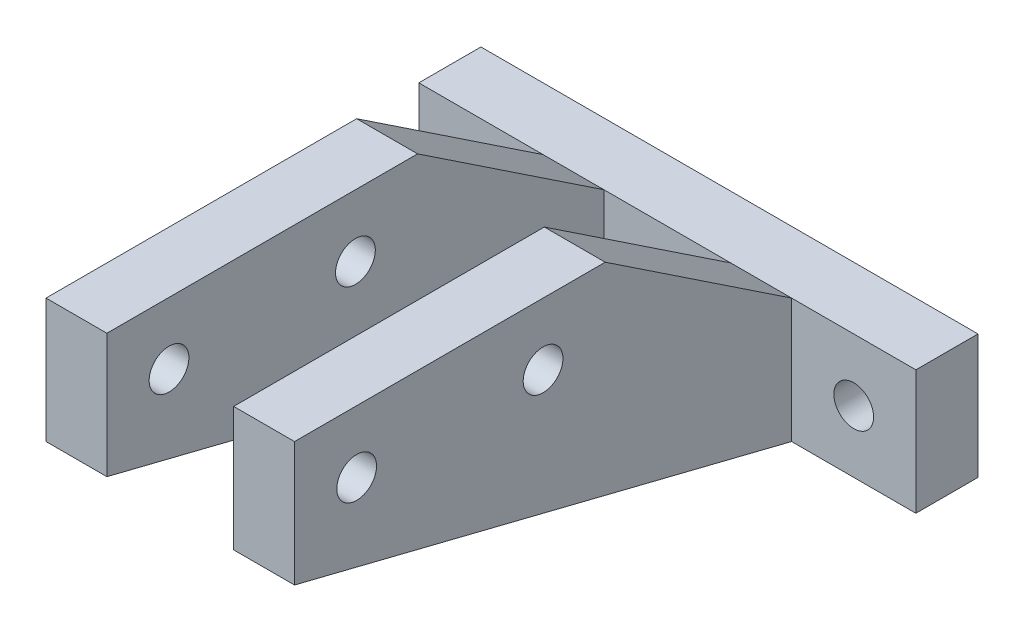
ISO-10303-21;
HEADER;
FILE_DESCRIPTION(('STEP AP214'),'2;1');
FILE_NAME('part.step','',(''),(''),'','','');
FILE_SCHEMA(('AUTOMOTIVE_DESIGN { 1 0 10303 214 1 1 1 1 }'));
ENDSEC;
DATA;
#1=APPLICATION_CONTEXT('core data for automotive mechanical design processes');
#2=APPLICATION_PROTOCOL_DEFINITION('international standard','automotive_design',2000,#1);
#3=PRODUCT_CONTEXT('',#1,'mechanical');
#4=PRODUCT('Part','Part','',(#3));
#5=PRODUCT_RELATED_PRODUCT_CATEGORY('part','',(#4));
#6=PRODUCT_DEFINITION_FORMATION('','',#4);
#7=PRODUCT_DEFINITION_CONTEXT('part definition',#1,'design');
#8=PRODUCT_DEFINITION('design','',#6,#7);
#9=PRODUCT_DEFINITION_SHAPE('','',#8);
#10=(LENGTH_UNIT() NAMED_UNIT(*) SI_UNIT(.MILLI.,.METRE.));
#11=(NAMED_UNIT(*) PLANE_ANGLE_UNIT() SI_UNIT($,.RADIAN.));
#12=(NAMED_UNIT(*) SI_UNIT($,.STERADIAN.) SOLID_ANGLE_UNIT());
#13=UNCERTAINTY_MEASURE_WITH_UNIT(LENGTH_MEASURE(1.E-05),#10,'distance_accuracy_value','');
#14=(GEOMETRIC_REPRESENTATION_CONTEXT(3) GLOBAL_UNCERTAINTY_ASSIGNED_CONTEXT((#13)) GLOBAL_UNIT_ASSIGNED_CONTEXT((#10,
#11,#12)) REPRESENTATION_CONTEXT('',''));
#15=CARTESIAN_POINT('',(0.,0.,0.));
#16=DIRECTION('',(0.,0.,1.));
#17=DIRECTION('',(1.,0.,0.));
#18=AXIS2_PLACEMENT_3D('',#15,#16,#17);
#19=CARTESIAN_POINT('',(0.,0.,5.));
#20=DIRECTION('',(0.,0.,1.));
#21=DIRECTION('',(1.,0.,0.));
#22=AXIS2_PLACEMENT_3D('',#19,#20,#21);
#23=PLANE('',#22);
#24=DIRECTION('',(0.,1.,0.));
#25=VECTOR('',#24,1.);
#26=CARTESIAN_POINT('',(-5.1,-5.,5.));
#27=LINE('',#26,#25);
#28=CARTESIAN_POINT('',(-5.1,0.,5.));
#29=VERTEX_POINT('',#28);
#30=CARTESIAN_POINT('',(-5.1,5.,5.));
#31=VERTEX_POINT('',#30);
#32=EDGE_CURVE('E242',#29,#31,#27,.T.);
#33=ORIENTED_EDGE('',*,*,#32,.F.);
#34=DIRECTION('',(-1.,0.,0.));
#35=VECTOR('',#34,1.);
#36=CARTESIAN_POINT('',(-5.1,0.,5.));
#37=LINE('',#36,#35);
#38=CARTESIAN_POINT('',(5.10000000000001,0.,5.));
#39=VERTEX_POINT('',#38);
#40=EDGE_CURVE('E167',#39,#29,#37,.T.);
#41=ORIENTED_EDGE('',*,*,#40,.F.);
#42=DIRECTION('',(0.,1.,0.));
#43=VECTOR('',#42,1.);
#44=CARTESIAN_POINT('',(5.10000000000001,0.,5.));
#45=LINE('',#44,#43);
#46=CARTESIAN_POINT('',(5.10000000000001,5.,5.));
#47=VERTEX_POINT('',#46);
#48=EDGE_CURVE('E254',#39,#47,#45,.T.);
#49=ORIENTED_EDGE('',*,*,#48,.T.);
#50=DIRECTION('',(-1.,0.,0.));
#51=VECTOR('',#50,1.);
#52=CARTESIAN_POINT('',(-20.,5.,5.));
#53=LINE('',#52,#51);
#54=EDGE_CURVE('E273',#47,#31,#53,.T.);
#55=ORIENTED_EDGE('',*,*,#54,.T.);
#56=EDGE_LOOP('',(#33,#41,#49,#55));
#57=FACE_BOUND('',#56,.T.);
#58=ADVANCED_FACE('F33',(#57),#23,.T.);
#59=CARTESIAN_POINT('',(-5.1,-5.,45.));
#60=DIRECTION('',(-1.,0.,0.));
#61=DIRECTION('',(0.,0.,1.));
#62=AXIS2_PLACEMENT_3D('',#59,#60,#61);
#63=PLANE('',#62);
#64=CARTESIAN_POINT('',(-5.1,10.,40.));
#65=DIRECTION('',(-1.,0.,0.));
#66=DIRECTION('',(0.,0.,1.));
#67=AXIS2_PLACEMENT_3D('',#64,#65,#66);
#68=CIRCLE('',#67,1.6);
#69=CARTESIAN_POINT('',(-5.09999999999999,10.,41.6));
#70=VERTEX_POINT('',#69);
#71=EDGE_CURVE('E224',#70,#70,#68,.T.);
#72=ORIENTED_EDGE('',*,*,#71,.T.);
#73=EDGE_LOOP('',(#72));
#74=FACE_BOUND('',#73,.T.);
#75=CARTESIAN_POINT('',(-5.1,10.,25.));
#76=DIRECTION('',(-1.,0.,0.));
#77=DIRECTION('',(0.,0.,1.));
#78=AXIS2_PLACEMENT_3D('',#75,#76,#77);
#79=CIRCLE('',#78,1.6);
#80=CARTESIAN_POINT('',(-5.09999999999999,10.,26.6));
#81=VERTEX_POINT('',#80);
#82=EDGE_CURVE('E220',#81,#81,#79,.T.);
#83=ORIENTED_EDGE('',*,*,#82,.T.);
#84=EDGE_LOOP('',(#83));
#85=FACE_BOUND('',#84,.T.);
#86=DIRECTION('',(0.,0.,-1.));
#87=VECTOR('',#86,1.);
#88=CARTESIAN_POINT('',(-5.1,0.,17.));
#89=LINE('',#88,#87);
#90=CARTESIAN_POINT('',(-5.1,0.,17.));
#91=VERTEX_POINT('',#90);
#92=EDGE_CURVE('E53',#91,#29,#89,.T.);
#93=ORIENTED_EDGE('',*,*,#92,.T.);
#94=ORIENTED_EDGE('',*,*,#32,.T.);
#95=DIRECTION('',(0.,0.554700196225229,0.832050294337844));
#96=VECTOR('',#95,1.);
#97=CARTESIAN_POINT('',(-5.1,20.3846153846154,28.0769230769231));
#98=LINE('',#97,#96);
#99=CARTESIAN_POINT('',(-5.1,15.,20.));
#100=VERTEX_POINT('',#99);
#101=EDGE_CURVE('E204',#31,#100,#98,.T.);
#102=ORIENTED_EDGE('',*,*,#101,.T.);
#103=DIRECTION('',(0.,0.,-1.));
#104=VECTOR('',#103,1.);
#105=CARTESIAN_POINT('',(-5.1,15.,45.));
#106=LINE('',#105,#104);
#107=CARTESIAN_POINT('',(-5.1,15.,45.));
#108=VERTEX_POINT('',#107);
#109=EDGE_CURVE('E259',#108,#100,#106,.T.);
#110=ORIENTED_EDGE('',*,*,#109,.F.);
#111=DIRECTION('',(0.,1.,0.));
#112=VECTOR('',#111,1.);
#113=CARTESIAN_POINT('',(-5.1,-5.,45.));
#114=LINE('',#113,#112);
#115=CARTESIAN_POINT('',(-5.1,5.,45.));
#116=VERTEX_POINT('',#115);
#117=EDGE_CURVE('E246',#116,#108,#114,.T.);
#118=ORIENTED_EDGE('',*,*,#117,.F.);
#119=DIRECTION('',(0.,-0.242535625036333,-0.970142500145332));
#120=VECTOR('',#119,1.);
#121=CARTESIAN_POINT('',(-5.1,4.41176470588235,42.6470588235294));
#122=LINE('',#121,#120);
#123=CARTESIAN_POINT('',(-5.1,-2.,17.));
#124=VERTEX_POINT('',#123);
#125=EDGE_CURVE('E153',#116,#124,#122,.T.);
#126=ORIENTED_EDGE('',*,*,#125,.T.);
#127=DIRECTION('',(0.,-1.,0.));
#128=VECTOR('',#127,1.);
#129=CARTESIAN_POINT('',(-5.1,-2.,17.));
#130=LINE('',#129,#128);
#131=EDGE_CURVE('E48',#91,#124,#130,.T.);
#132=ORIENTED_EDGE('',*,*,#131,.F.);
#133=EDGE_LOOP('',(#93,#94,#102,#110,#118,#126,#132));
#134=FACE_BOUND('',#133,.T.);
#135=ADVANCED_FACE('F343',(#74,#85,#134),#63,.F.);
#136=CARTESIAN_POINT('',(5.10000000000001,-5.,45.));
#137=DIRECTION('',(1.,0.,0.));
#138=DIRECTION('',(0.,0.,-1.));
#139=AXIS2_PLACEMENT_3D('',#136,#137,#138);
#140=PLANE('',#139);
#141=CARTESIAN_POINT('',(5.10000000000001,10.,40.));
#142=DIRECTION('',(1.,0.,0.));
#143=DIRECTION('',(0.,0.,-1.));
#144=AXIS2_PLACEMENT_3D('',#141,#142,#143);
#145=CIRCLE('',#144,1.6);
#146=CARTESIAN_POINT('',(5.10000000000001,10.,41.6));
#147=VERTEX_POINT('',#146);
#148=EDGE_CURVE('E223',#147,#147,#145,.T.);
#149=ORIENTED_EDGE('',*,*,#148,.T.);
#150=EDGE_LOOP('',(#149));
#151=FACE_BOUND('',#150,.T.);
#152=CARTESIAN_POINT('',(5.10000000000001,10.,25.));
#153=DIRECTION('',(1.,0.,0.));
#154=DIRECTION('',(0.,0.,-1.));
#155=AXIS2_PLACEMENT_3D('',#152,#153,#154);
#156=CIRCLE('',#155,1.6);
#157=CARTESIAN_POINT('',(5.10000000000001,10.,26.6));
#158=VERTEX_POINT('',#157);
#159=EDGE_CURVE('E215',#158,#158,#156,.T.);
#160=ORIENTED_EDGE('',*,*,#159,.T.);
#161=EDGE_LOOP('',(#160));
#162=FACE_BOUND('',#161,.T.);
#163=DIRECTION('',(0.,0.,-1.));
#164=VECTOR('',#163,1.);
#165=CARTESIAN_POINT('',(5.10000000000001,0.,17.));
#166=LINE('',#165,#164);
#167=CARTESIAN_POINT('',(5.10000000000001,0.,17.));
#168=VERTEX_POINT('',#167);
#169=EDGE_CURVE('E161',#168,#39,#166,.T.);
#170=ORIENTED_EDGE('',*,*,#169,.F.);
#171=DIRECTION('',(0.,1.,0.));
#172=VECTOR('',#171,1.);
#173=CARTESIAN_POINT('',(5.10000000000001,-2.,17.));
#174=LINE('',#173,#172);
#175=CARTESIAN_POINT('',(5.10000000000001,-2.,17.));
#176=VERTEX_POINT('',#175);
#177=EDGE_CURVE('E157',#176,#168,#174,.T.);
#178=ORIENTED_EDGE('',*,*,#177,.F.);
#179=DIRECTION('',(0.,0.242535625036333,0.970142500145332));
#180=VECTOR('',#179,1.);
#181=CARTESIAN_POINT('',(5.10000000000001,4.41176470588235,42.6470588235294));
#182=LINE('',#181,#180);
#183=CARTESIAN_POINT('',(5.10000000000001,5.,45.));
#184=VERTEX_POINT('',#183);
#185=EDGE_CURVE('E145',#176,#184,#182,.T.);
#186=ORIENTED_EDGE('',*,*,#185,.T.);
#187=DIRECTION('',(0.,-1.,0.));
#188=VECTOR('',#187,1.);
#189=CARTESIAN_POINT('',(5.10000000000001,-5.,45.));
#190=LINE('',#189,#188);
#191=CARTESIAN_POINT('',(5.10000000000001,15.,45.));
#192=VERTEX_POINT('',#191);
#193=EDGE_CURVE('E232',#192,#184,#190,.T.);
#194=ORIENTED_EDGE('',*,*,#193,.F.);
#195=DIRECTION('',(0.,0.,-1.));
#196=VECTOR('',#195,1.);
#197=CARTESIAN_POINT('',(5.10000000000001,15.,45.));
#198=LINE('',#197,#196);
#199=CARTESIAN_POINT('',(5.10000000000001,15.,20.));
#200=VERTEX_POINT('',#199);
#201=EDGE_CURVE('E234',#192,#200,#198,.T.);
#202=ORIENTED_EDGE('',*,*,#201,.T.);
#203=DIRECTION('',(0.,-0.554700196225229,-0.832050294337844));
#204=VECTOR('',#203,1.);
#205=CARTESIAN_POINT('',(5.10000000000001,20.3846153846154,28.0769230769231));
#206=LINE('',#205,#204);
#207=EDGE_CURVE('E41',#200,#47,#206,.T.);
#208=ORIENTED_EDGE('',*,*,#207,.T.);
#209=ORIENTED_EDGE('',*,*,#48,.F.);
#210=EDGE_LOOP('',(#170,#178,#186,#194,#202,#208,#209));
#211=FACE_BOUND('',#210,.T.);
#212=ADVANCED_FACE('F158',(#151,#162,#211),#140,.F.);
#213=CARTESIAN_POINT('',(15.,0.,5.));
#214=DIRECTION('',(0.,0.,1.));
#215=DIRECTION('',(1.,0.,0.));
#216=AXIS2_PLACEMENT_3D('',#213,#214,#215);
#217=CIRCLE('',#216,1.6);
#218=CARTESIAN_POINT('',(16.6,0.,5.));
#219=VERTEX_POINT('',#218);
#220=EDGE_CURVE('E180',#219,#219,#217,.F.);
#221=ORIENTED_EDGE('',*,*,#220,.T.);
#222=EDGE_LOOP('',(#221));
#223=FACE_BOUND('',#222,.T.);
#224=CARTESIAN_POINT('',(20.,5.,5.));
#225=VERTEX_POINT('',#224);
#226=CARTESIAN_POINT('',(10.,5.,5.));
#227=VERTEX_POINT('',#226);
#228=EDGE_CURVE('E268',#225,#227,#53,.T.);
#229=ORIENTED_EDGE('',*,*,#228,.T.);
#230=DIRECTION('',(0.,1.,0.));
#231=VECTOR('',#230,1.);
#232=CARTESIAN_POINT('',(10.,-5.,5.));
#233=LINE('',#232,#231);
#234=CARTESIAN_POINT('',(10.,-5.,5.));
#235=VERTEX_POINT('',#234);
#236=EDGE_CURVE('E227',#235,#227,#233,.T.);
#237=ORIENTED_EDGE('',*,*,#236,.F.);
#238=DIRECTION('',(1.,0.,0.));
#239=VECTOR('',#238,1.);
#240=CARTESIAN_POINT('',(-20.,-5.,5.));
#241=LINE('',#240,#239);
#242=CARTESIAN_POINT('',(20.,-5.,5.));
#243=VERTEX_POINT('',#242);
#244=EDGE_CURVE('E276',#235,#243,#241,.T.);
#245=ORIENTED_EDGE('',*,*,#244,.T.);
#246=DIRECTION('',(0.,1.,0.));
#247=VECTOR('',#246,1.);
#248=CARTESIAN_POINT('',(20.,5.,5.));
#249=LINE('',#248,#247);
#250=EDGE_CURVE('E263',#243,#225,#249,.T.);
#251=ORIENTED_EDGE('',*,*,#250,.T.);
#252=EDGE_LOOP('',(#229,#237,#245,#251));
#253=FACE_BOUND('',#252,.T.);
#254=ADVANCED_FACE('F359',(#223,#253),#23,.T.);
#255=CARTESIAN_POINT('',(-15.,0.,5.));
#256=DIRECTION('',(0.,0.,1.));
#257=DIRECTION('',(1.,0.,0.));
#258=AXIS2_PLACEMENT_3D('',#255,#256,#257);
#259=CIRCLE('',#258,1.6);
#260=CARTESIAN_POINT('',(-13.4,0.,5.));
#261=VERTEX_POINT('',#260);
#262=EDGE_CURVE('E175',#261,#261,#259,.F.);
#263=ORIENTED_EDGE('',*,*,#262,.T.);
#264=EDGE_LOOP('',(#263));
#265=FACE_BOUND('',#264,.T.);
#266=DIRECTION('',(0.,-1.,0.));
#267=VECTOR('',#266,1.);
#268=CARTESIAN_POINT('',(-10.,-5.,5.));
#269=LINE('',#268,#267);
#270=CARTESIAN_POINT('',(-10.,5.,5.));
#271=VERTEX_POINT('',#270);
#272=CARTESIAN_POINT('',(-10.,-5.,5.));
#273=VERTEX_POINT('',#272);
#274=EDGE_CURVE('E251',#271,#273,#269,.T.);
#275=ORIENTED_EDGE('',*,*,#274,.F.);
#276=CARTESIAN_POINT('',(-20.,5.,5.));
#277=VERTEX_POINT('',#276);
#278=EDGE_CURVE('E266',#271,#277,#53,.T.);
#279=ORIENTED_EDGE('',*,*,#278,.T.);
#280=DIRECTION('',(0.,-1.,0.));
#281=VECTOR('',#280,1.);
#282=CARTESIAN_POINT('',(-20.,5.,5.));
#283=LINE('',#282,#281);
#284=CARTESIAN_POINT('',(-20.,-5.,5.));
#285=VERTEX_POINT('',#284);
#286=EDGE_CURVE('E271',#277,#285,#283,.T.);
#287=ORIENTED_EDGE('',*,*,#286,.T.);
#288=EDGE_CURVE('E277',#285,#273,#241,.T.);
#289=ORIENTED_EDGE('',*,*,#288,.T.);
#290=EDGE_LOOP('',(#275,#279,#287,#289));
#291=FACE_BOUND('',#290,.T.);
#292=ADVANCED_FACE('F320',(#265,#291),#23,.T.);
#293=CARTESIAN_POINT('',(20.,5.,5.));
#294=DIRECTION('',(-1.,0.,0.));
#295=DIRECTION('',(0.,-1.,0.));
#296=AXIS2_PLACEMENT_3D('',#293,#294,#295);
#297=PLANE('',#296);
#298=DIRECTION('',(0.,1.,0.));
#299=VECTOR('',#298,1.);
#300=CARTESIAN_POINT('',(20.,5.,0.));
#301=LINE('',#300,#299);
#302=CARTESIAN_POINT('',(20.,-5.,0.));
#303=VERTEX_POINT('',#302);
#304=CARTESIAN_POINT('',(20.,5.,0.));
#305=VERTEX_POINT('',#304);
#306=EDGE_CURVE('E262',#303,#305,#301,.T.);
#307=ORIENTED_EDGE('',*,*,#306,.T.);
#308=DIRECTION('',(0.,0.,-1.));
#309=VECTOR('',#308,1.);
#310=CARTESIAN_POINT('',(20.,5.,5.));
#311=LINE('',#310,#309);
#312=EDGE_CURVE('E255',#225,#305,#311,.T.);
#313=ORIENTED_EDGE('',*,*,#312,.F.);
#314=ORIENTED_EDGE('',*,*,#250,.F.);
#315=DIRECTION('',(0.,0.,-1.));
#316=VECTOR('',#315,1.);
#317=CARTESIAN_POINT('',(20.,-5.,5.));
#318=LINE('',#317,#316);
#319=EDGE_CURVE('E280',#243,#303,#318,.T.);
#320=ORIENTED_EDGE('',*,*,#319,.T.);
#321=EDGE_LOOP('',(#307,#313,#314,#320));
#322=FACE_BOUND('',#321,.T.);
#323=ADVANCED_FACE('F35',(#322),#297,.F.);
#324=CARTESIAN_POINT('',(-20.,5.,5.));
#325=DIRECTION('',(0.,-1.,0.));
#326=DIRECTION('',(1.,0.,0.));
#327=AXIS2_PLACEMENT_3D('',#324,#325,#326);
#328=PLANE('',#327);
#329=DIRECTION('',(-1.,0.,0.));
#330=VECTOR('',#329,1.);
#331=CARTESIAN_POINT('',(-20.,5.,0.));
#332=LINE('',#331,#330);
#333=CARTESIAN_POINT('',(-20.,5.,0.));
#334=VERTEX_POINT('',#333);
#335=EDGE_CURVE('E283',#305,#334,#332,.T.);
#336=ORIENTED_EDGE('',*,*,#335,.T.);
#337=DIRECTION('',(0.,0.,-1.));
#338=VECTOR('',#337,1.);
#339=CARTESIAN_POINT('',(-20.,5.,5.));
#340=LINE('',#339,#338);
#341=EDGE_CURVE('E293',#277,#334,#340,.T.);
#342=ORIENTED_EDGE('',*,*,#341,.F.);
#343=ORIENTED_EDGE('',*,*,#278,.F.);
#344=EDGE_CURVE('E274',#31,#271,#53,.T.);
#345=ORIENTED_EDGE('',*,*,#344,.F.);
#346=ORIENTED_EDGE('',*,*,#54,.F.);
#347=EDGE_CURVE('E272',#227,#47,#53,.T.);
#348=ORIENTED_EDGE('',*,*,#347,.F.);
#349=ORIENTED_EDGE('',*,*,#228,.F.);
#350=ORIENTED_EDGE('',*,*,#312,.T.);
#351=EDGE_LOOP('',(#336,#342,#343,#345,#346,#348,#349,#350));
#352=FACE_BOUND('',#351,.T.);
#353=ADVANCED_FACE('F311',(#352),#328,.F.);
#354=CARTESIAN_POINT('',(-20.,5.,5.));
#355=DIRECTION('',(1.,0.,0.));
#356=DIRECTION('',(0.,0.,-1.));
#357=AXIS2_PLACEMENT_3D('',#354,#355,#356);
#358=PLANE('',#357);
#359=DIRECTION('',(0.,-1.,0.));
#360=VECTOR('',#359,1.);
#361=CARTESIAN_POINT('',(-20.,5.,0.));
#362=LINE('',#361,#360);
#363=CARTESIAN_POINT('',(-20.,-5.,0.));
#364=VERTEX_POINT('',#363);
#365=EDGE_CURVE('E285',#334,#364,#362,.T.);
#366=ORIENTED_EDGE('',*,*,#365,.T.);
#367=DIRECTION('',(0.,0.,-1.));
#368=VECTOR('',#367,1.);
#369=CARTESIAN_POINT('',(-20.,-5.,5.));
#370=LINE('',#369,#368);
#371=EDGE_CURVE('E290',#285,#364,#370,.T.);
#372=ORIENTED_EDGE('',*,*,#371,.F.);
#373=ORIENTED_EDGE('',*,*,#286,.F.);
#374=ORIENTED_EDGE('',*,*,#341,.T.);
#375=EDGE_LOOP('',(#366,#372,#373,#374));
#376=FACE_BOUND('',#375,.T.);
#377=ADVANCED_FACE('F325',(#376),#358,.F.);
#378=CARTESIAN_POINT('',(-20.,-5.,5.));
#379=DIRECTION('',(0.,1.,0.));
#380=DIRECTION('',(0.,0.,1.));
#381=AXIS2_PLACEMENT_3D('',#378,#379,#380);
#382=PLANE('',#381);
#383=ORIENTED_EDGE('',*,*,#244,.F.);
#384=DIRECTION('',(-1.,0.,0.));
#385=VECTOR('',#384,1.);
#386=CARTESIAN_POINT('',(51.2310562561766,-5.,5.));
#387=LINE('',#386,#385);
#388=EDGE_CURVE('E190',#235,#273,#387,.T.);
#389=ORIENTED_EDGE('',*,*,#388,.T.);
#390=ORIENTED_EDGE('',*,*,#288,.F.);
#391=ORIENTED_EDGE('',*,*,#371,.T.);
#392=DIRECTION('',(1.,0.,0.));
#393=VECTOR('',#392,1.);
#394=CARTESIAN_POINT('',(-20.,-5.,0.));
#395=LINE('',#394,#393);
#396=EDGE_CURVE('E267',#364,#303,#395,.T.);
#397=ORIENTED_EDGE('',*,*,#396,.T.);
#398=ORIENTED_EDGE('',*,*,#319,.F.);
#399=EDGE_LOOP('',(#383,#389,#390,#391,#397,#398));
#400=FACE_BOUND('',#399,.T.);
#401=ADVANCED_FACE('F330',(#400),#382,.F.);
#402=CARTESIAN_POINT('',(0.,0.,0.));
#403=DIRECTION('',(0.,0.,1.));
#404=DIRECTION('',(1.,0.,0.));
#405=AXIS2_PLACEMENT_3D('',#402,#403,#404);
#406=PLANE('',#405);
#407=CARTESIAN_POINT('',(15.,0.,0.));
#408=DIRECTION('',(0.,0.,-1.));
#409=DIRECTION('',(-1.,0.,0.));
#410=AXIS2_PLACEMENT_3D('',#407,#408,#409);
#411=CIRCLE('',#410,1.6);
#412=CARTESIAN_POINT('',(13.4,0.,0.));
#413=VERTEX_POINT('',#412);
#414=EDGE_CURVE('E176',#413,#413,#411,.T.);
#415=ORIENTED_EDGE('',*,*,#414,.F.);
#416=EDGE_LOOP('',(#415));
#417=FACE_BOUND('',#416,.T.);
#418=CARTESIAN_POINT('',(-15.,0.,0.));
#419=DIRECTION('',(0.,0.,-1.));
#420=DIRECTION('',(1.,0.,0.));
#421=AXIS2_PLACEMENT_3D('',#418,#419,#420);
#422=CIRCLE('',#421,1.6);
#423=CARTESIAN_POINT('',(-13.4,0.,0.));
#424=VERTEX_POINT('',#423);
#425=EDGE_CURVE('E183',#424,#424,#422,.T.);
#426=ORIENTED_EDGE('',*,*,#425,.F.);
#427=EDGE_LOOP('',(#426));
#428=FACE_BOUND('',#427,.T.);
#429=ORIENTED_EDGE('',*,*,#306,.F.);
#430=ORIENTED_EDGE('',*,*,#396,.F.);
#431=ORIENTED_EDGE('',*,*,#365,.F.);
#432=ORIENTED_EDGE('',*,*,#335,.F.);
#433=EDGE_LOOP('',(#429,#430,#431,#432));
#434=FACE_BOUND('',#433,.T.);
#435=ADVANCED_FACE('F391',(#417,#428,#434),#406,.F.);
#436=CARTESIAN_POINT('',(-10.,-5.,45.));
#437=DIRECTION('',(1.,0.,0.));
#438=DIRECTION('',(0.,0.,-1.));
#439=AXIS2_PLACEMENT_3D('',#436,#437,#438);
#440=PLANE('',#439);
#441=CARTESIAN_POINT('',(-10.,10.,40.));
#442=DIRECTION('',(-1.,0.,0.));
#443=DIRECTION('',(0.,0.,1.));
#444=AXIS2_PLACEMENT_3D('',#441,#442,#443);
#445=CIRCLE('',#444,1.6);
#446=CARTESIAN_POINT('',(-9.99999999999999,10.,41.6));
#447=VERTEX_POINT('',#446);
#448=EDGE_CURVE('E208',#447,#447,#445,.T.);
#449=ORIENTED_EDGE('',*,*,#448,.F.);
#450=EDGE_LOOP('',(#449));
#451=FACE_BOUND('',#450,.T.);
#452=CARTESIAN_POINT('',(-10.,10.,25.));
#453=DIRECTION('',(-1.,0.,0.));
#454=DIRECTION('',(0.,0.,1.));
#455=AXIS2_PLACEMENT_3D('',#452,#453,#454);
#456=CIRCLE('',#455,1.6);
#457=CARTESIAN_POINT('',(-9.99999999999999,10.,26.6));
#458=VERTEX_POINT('',#457);
#459=EDGE_CURVE('E207',#458,#458,#456,.T.);
#460=ORIENTED_EDGE('',*,*,#459,.F.);
#461=EDGE_LOOP('',(#460));
#462=FACE_BOUND('',#461,.T.);
#463=ORIENTED_EDGE('',*,*,#274,.T.);
#464=DIRECTION('',(0.,-0.242535625036333,-0.970142500145332));
#465=VECTOR('',#464,1.);
#466=CARTESIAN_POINT('',(-10.,5.,45.));
#467=LINE('',#466,#465);
#468=CARTESIAN_POINT('',(-10.,5.,45.));
#469=VERTEX_POINT('',#468);
#470=EDGE_CURVE('E179',#469,#273,#467,.T.);
#471=ORIENTED_EDGE('',*,*,#470,.F.);
#472=DIRECTION('',(0.,-1.,0.));
#473=VECTOR('',#472,1.);
#474=CARTESIAN_POINT('',(-10.,-5.,45.));
#475=LINE('',#474,#473);
#476=CARTESIAN_POINT('',(-10.,15.,45.));
#477=VERTEX_POINT('',#476);
#478=EDGE_CURVE('E243',#477,#469,#475,.T.);
#479=ORIENTED_EDGE('',*,*,#478,.F.);
#480=DIRECTION('',(0.,0.,-1.));
#481=VECTOR('',#480,1.);
#482=CARTESIAN_POINT('',(-10.,15.,45.));
#483=LINE('',#482,#481);
#484=CARTESIAN_POINT('',(-10.,15.,20.));
#485=VERTEX_POINT('',#484);
#486=EDGE_CURVE('E250',#477,#485,#483,.T.);
#487=ORIENTED_EDGE('',*,*,#486,.T.);
#488=DIRECTION('',(0.,0.554700196225229,0.832050294337844));
#489=VECTOR('',#488,1.);
#490=CARTESIAN_POINT('',(-10.,5.,5.));
#491=LINE('',#490,#489);
#492=EDGE_CURVE('E196',#271,#485,#491,.T.);
#493=ORIENTED_EDGE('',*,*,#492,.F.);
#494=EDGE_LOOP('',(#463,#471,#479,#487,#493));
#495=FACE_BOUND('',#494,.T.);
#496=ADVANCED_FACE('F333',(#451,#462,#495),#440,.F.);
#497=CARTESIAN_POINT('',(-10.,15.,45.));
#498=DIRECTION('',(0.,-1.,0.));
#499=DIRECTION('',(0.,0.,-1.));
#500=AXIS2_PLACEMENT_3D('',#497,#498,#499);
#501=PLANE('',#500);
#502=ORIENTED_EDGE('',*,*,#109,.T.);
#503=DIRECTION('',(-1.,0.,0.));
#504=VECTOR('',#503,1.);
#505=CARTESIAN_POINT('',(28.02775637732,15.,20.));
#506=LINE('',#505,#504);
#507=EDGE_CURVE('E198',#100,#485,#506,.T.);
#508=ORIENTED_EDGE('',*,*,#507,.T.);
#509=ORIENTED_EDGE('',*,*,#486,.F.);
#510=DIRECTION('',(-1.,0.,0.));
#511=VECTOR('',#510,1.);
#512=CARTESIAN_POINT('',(-10.,15.,45.));
#513=LINE('',#512,#511);
#514=EDGE_CURVE('E248',#108,#477,#513,.T.);
#515=ORIENTED_EDGE('',*,*,#514,.F.);
#516=EDGE_LOOP('',(#502,#508,#509,#515));
#517=FACE_BOUND('',#516,.T.);
#518=ADVANCED_FACE('F339',(#517),#501,.F.);
#519=CARTESIAN_POINT('',(0.,0.,45.));
#520=DIRECTION('',(0.,0.,-1.));
#521=DIRECTION('',(-1.,0.,0.));
#522=AXIS2_PLACEMENT_3D('',#519,#520,#521);
#523=PLANE('',#522);
#524=ORIENTED_EDGE('',*,*,#478,.T.);
#525=DIRECTION('',(-1.,0.,0.));
#526=VECTOR('',#525,1.);
#527=CARTESIAN_POINT('',(51.2310562561766,5.,45.));
#528=LINE('',#527,#526);
#529=EDGE_CURVE('E189',#116,#469,#528,.T.);
#530=ORIENTED_EDGE('',*,*,#529,.F.);
#531=ORIENTED_EDGE('',*,*,#117,.T.);
#532=ORIENTED_EDGE('',*,*,#514,.T.);
#533=EDGE_LOOP('',(#524,#530,#531,#532));
#534=FACE_BOUND('',#533,.T.);
#535=ADVANCED_FACE('F457',(#534),#523,.F.);
#536=CARTESIAN_POINT('',(10.,-5.,45.));
#537=DIRECTION('',(-1.,0.,0.));
#538=DIRECTION('',(0.,0.,1.));
#539=AXIS2_PLACEMENT_3D('',#536,#537,#538);
#540=PLANE('',#539);
#541=CARTESIAN_POINT('',(10.,10.,40.));
#542=DIRECTION('',(-1.,0.,0.));
#543=DIRECTION('',(0.,0.,1.));
#544=AXIS2_PLACEMENT_3D('',#541,#542,#543);
#545=CIRCLE('',#544,1.6);
#546=CARTESIAN_POINT('',(10.,10.,41.6));
#547=VERTEX_POINT('',#546);
#548=EDGE_CURVE('E211',#547,#547,#545,.F.);
#549=ORIENTED_EDGE('',*,*,#548,.F.);
#550=EDGE_LOOP('',(#549));
#551=FACE_BOUND('',#550,.T.);
#552=CARTESIAN_POINT('',(10.,10.,25.));
#553=DIRECTION('',(-1.,0.,0.));
#554=DIRECTION('',(0.,0.,1.));
#555=AXIS2_PLACEMENT_3D('',#552,#553,#554);
#556=CIRCLE('',#555,1.6);
#557=CARTESIAN_POINT('',(10.,10.,26.6));
#558=VERTEX_POINT('',#557);
#559=EDGE_CURVE('E212',#558,#558,#556,.F.);
#560=ORIENTED_EDGE('',*,*,#559,.F.);
#561=EDGE_LOOP('',(#560));
#562=FACE_BOUND('',#561,.T.);
#563=DIRECTION('',(0.,1.,0.));
#564=VECTOR('',#563,1.);
#565=CARTESIAN_POINT('',(10.,-5.,45.));
#566=LINE('',#565,#564);
#567=CARTESIAN_POINT('',(10.,5.,45.));
#568=VERTEX_POINT('',#567);
#569=CARTESIAN_POINT('',(10.,15.,45.));
#570=VERTEX_POINT('',#569);
#571=EDGE_CURVE('E228',#568,#570,#566,.T.);
#572=ORIENTED_EDGE('',*,*,#571,.F.);
#573=DIRECTION('',(0.,0.242535625036333,0.970142500145332));
#574=VECTOR('',#573,1.);
#575=CARTESIAN_POINT('',(10.,5.,45.));
#576=LINE('',#575,#574);
#577=EDGE_CURVE('E154',#235,#568,#576,.T.);
#578=ORIENTED_EDGE('',*,*,#577,.F.);
#579=ORIENTED_EDGE('',*,*,#236,.T.);
#580=DIRECTION('',(0.,-0.554700196225229,-0.832050294337844));
#581=VECTOR('',#580,1.);
#582=CARTESIAN_POINT('',(10.,5.,5.));
#583=LINE('',#582,#581);
#584=CARTESIAN_POINT('',(10.,15.,20.));
#585=VERTEX_POINT('',#584);
#586=EDGE_CURVE('E202',#585,#227,#583,.T.);
#587=ORIENTED_EDGE('',*,*,#586,.F.);
#588=DIRECTION('',(0.,0.,-1.));
#589=VECTOR('',#588,1.);
#590=CARTESIAN_POINT('',(10.,15.,45.));
#591=LINE('',#590,#589);
#592=EDGE_CURVE('E239',#570,#585,#591,.T.);
#593=ORIENTED_EDGE('',*,*,#592,.F.);
#594=EDGE_LOOP('',(#572,#578,#579,#587,#593));
#595=FACE_BOUND('',#594,.T.);
#596=ADVANCED_FACE('F385',(#551,#562,#595),#540,.F.);
#597=CARTESIAN_POINT('',(10.,15.,45.));
#598=DIRECTION('',(0.,-1.,0.));
#599=DIRECTION('',(0.,0.,-1.));
#600=AXIS2_PLACEMENT_3D('',#597,#598,#599);
#601=PLANE('',#600);
#602=ORIENTED_EDGE('',*,*,#592,.T.);
#603=EDGE_CURVE('E199',#585,#200,#506,.T.);
#604=ORIENTED_EDGE('',*,*,#603,.T.);
#605=ORIENTED_EDGE('',*,*,#201,.F.);
#606=DIRECTION('',(-1.,0.,0.));
#607=VECTOR('',#606,1.);
#608=CARTESIAN_POINT('',(10.,15.,45.));
#609=LINE('',#608,#607);
#610=EDGE_CURVE('E230',#570,#192,#609,.T.);
#611=ORIENTED_EDGE('',*,*,#610,.F.);
#612=EDGE_LOOP('',(#602,#604,#605,#611));
#613=FACE_BOUND('',#612,.T.);
#614=ADVANCED_FACE('F456',(#613),#601,.F.);
#615=CARTESIAN_POINT('',(0.,0.,45.));
#616=DIRECTION('',(0.,0.,1.));
#617=DIRECTION('',(1.,0.,0.));
#618=AXIS2_PLACEMENT_3D('',#615,#616,#617);
#619=PLANE('',#618);
#620=EDGE_CURVE('E149',#568,#184,#528,.T.);
#621=ORIENTED_EDGE('',*,*,#620,.F.);
#622=ORIENTED_EDGE('',*,*,#571,.T.);
#623=ORIENTED_EDGE('',*,*,#610,.T.);
#624=ORIENTED_EDGE('',*,*,#193,.T.);
#625=EDGE_LOOP('',(#621,#622,#623,#624));
#626=FACE_BOUND('',#625,.T.);
#627=ADVANCED_FACE('F542',(#626),#619,.T.);
#628=CARTESIAN_POINT('',(14.5254833995939,10.,25.));
#629=DIRECTION('',(-1.,0.,0.));
#630=DIRECTION('',(0.,0.,1.));
#631=AXIS2_PLACEMENT_3D('',#628,#629,#630);
#632=CYLINDRICAL_SURFACE('',#631,1.6);
#633=CARTESIAN_POINT('',(10.,10.,26.6));
#634=CARTESIAN_POINT('',(9.94895833333335,10.,26.6));
#635=CARTESIAN_POINT('',(9.89791666666668,10.,26.6));
#636=CARTESIAN_POINT('',(9.79583333333334,10.,26.6));
#637=CARTESIAN_POINT('',(9.74479166666668,10.,26.6));
#638=CARTESIAN_POINT('',(9.64270833333335,10.,26.6));
#639=CARTESIAN_POINT('',(9.59166666666668,10.,26.6));
#640=CARTESIAN_POINT('',(9.48958333333335,10.,26.6));
#641=CARTESIAN_POINT('',(9.43854166666668,10.,26.6));
#642=CARTESIAN_POINT('',(9.33645833333335,10.,26.6));
#643=CARTESIAN_POINT('',(9.28541666666668,10.,26.6));
#644=CARTESIAN_POINT('',(9.18333333333335,10.,26.6));
#645=CARTESIAN_POINT('',(9.13229166666668,10.,26.6));
#646=CARTESIAN_POINT('',(9.03020833333335,10.,26.6));
#647=CARTESIAN_POINT('',(8.97916666666668,10.,26.6));
#648=CARTESIAN_POINT('',(8.87708333333335,10.,26.6));
#649=CARTESIAN_POINT('',(8.82604166666668,10.,26.6));
#650=CARTESIAN_POINT('',(8.72395833333335,10.,26.6));
#651=CARTESIAN_POINT('',(8.67291666666668,10.,26.6));
#652=CARTESIAN_POINT('',(8.57083333333335,10.,26.6));
#653=CARTESIAN_POINT('',(8.51979166666668,10.,26.6));
#654=CARTESIAN_POINT('',(8.41770833333335,10.,26.6));
#655=CARTESIAN_POINT('',(8.36666666666668,10.,26.6));
#656=CARTESIAN_POINT('',(8.26458333333335,10.,26.6));
#657=CARTESIAN_POINT('',(8.21354166666668,10.,26.6));
#658=CARTESIAN_POINT('',(8.11145833333335,10.,26.6));
#659=CARTESIAN_POINT('',(8.06041666666668,10.,26.6));
#660=CARTESIAN_POINT('',(7.95833333333335,10.,26.6));
#661=CARTESIAN_POINT('',(7.90729166666668,10.,26.6));
#662=CARTESIAN_POINT('',(7.80520833333335,10.,26.6));
#663=CARTESIAN_POINT('',(7.75416666666668,10.,26.6));
#664=CARTESIAN_POINT('',(7.65208333333335,10.,26.6));
#665=CARTESIAN_POINT('',(7.60104166666668,10.,26.6));
#666=CARTESIAN_POINT('',(7.49895833333334,10.,26.6));
#667=CARTESIAN_POINT('',(7.44791666666668,10.,26.6));
#668=CARTESIAN_POINT('',(7.34583333333335,10.,26.6));
#669=CARTESIAN_POINT('',(7.29479166666668,10.,26.6));
#670=CARTESIAN_POINT('',(7.19270833333335,10.,26.6));
#671=CARTESIAN_POINT('',(7.14166666666668,10.,26.6));
#672=CARTESIAN_POINT('',(7.03958333333335,10.,26.6));
#673=CARTESIAN_POINT('',(6.98854166666668,10.,26.6));
#674=CARTESIAN_POINT('',(6.88645833333335,10.,26.6));
#675=CARTESIAN_POINT('',(6.83541666666668,10.,26.6));
#676=CARTESIAN_POINT('',(6.73333333333335,10.,26.6));
#677=CARTESIAN_POINT('',(6.68229166666668,10.,26.6));
#678=CARTESIAN_POINT('',(6.58020833333335,10.,26.6));
#679=CARTESIAN_POINT('',(6.52916666666668,10.,26.6));
#680=CARTESIAN_POINT('',(6.42708333333335,10.,26.6));
#681=CARTESIAN_POINT('',(6.37604166666668,10.,26.6));
#682=CARTESIAN_POINT('',(6.27395833333335,10.,26.6));
#683=CARTESIAN_POINT('',(6.22291666666668,10.,26.6));
#684=CARTESIAN_POINT('',(6.12083333333335,10.,26.6));
#685=CARTESIAN_POINT('',(6.06979166666668,10.,26.6));
#686=CARTESIAN_POINT('',(5.96770833333335,10.,26.6));
#687=CARTESIAN_POINT('',(5.91666666666668,10.,26.6));
#688=CARTESIAN_POINT('',(5.81458333333335,10.,26.6));
#689=CARTESIAN_POINT('',(5.76354166666668,10.,26.6));
#690=CARTESIAN_POINT('',(5.66145833333335,10.,26.6));
#691=CARTESIAN_POINT('',(5.61041666666668,10.,26.6));
#692=CARTESIAN_POINT('',(5.50833333333335,10.,26.6));
#693=CARTESIAN_POINT('',(5.45729166666668,10.,26.6));
#694=CARTESIAN_POINT('',(5.35520833333335,10.,26.6));
#695=CARTESIAN_POINT('',(5.30416666666668,10.,26.6));
#696=CARTESIAN_POINT('',(5.20208333333335,10.,26.6));
#697=CARTESIAN_POINT('',(5.15104166666668,10.,26.6));
#698=CARTESIAN_POINT('',(5.10000000000001,10.,26.6));
#699=B_SPLINE_CURVE_WITH_KNOTS('',3,(#633,#634,#635,#636,#637,#638,#639,#640,#641,#642,#643,
#644,#645,#646,#647,#648,#649,#650,#651,#652,#653,#654,#655,#656,#657,#658,#659,#660,#661,#662,
#663,#664,#665,#666,#667,#668,#669,#670,#671,#672,#673,#674,#675,#676,#677,#678,#679,#680,#681,
#682,#683,#684,#685,#686,#687,#688,#689,#690,#691,#692,#693,#694,#695,#696,#697,#698),
.UNSPECIFIED.,.F.,.F.,(4,2,2,2,2,2,2,2,2,2,2,2,2,2,2,2,2,2,2,2,2,2,2,2,2,2,2,2,2,2,2,2,4),(0.,
0.153125,0.306249999999999,0.459374999999998,0.612499999999998,0.765624999999999,
0.918749999999999,1.071875,1.225,1.378125,1.53125,1.684375,1.8375,1.990625,2.14375,2.296875,
2.45,2.603125,2.75625,2.909375,3.0625,3.215625,3.36875,3.521875,3.675,3.828125,3.98125,4.134375,
4.2875,4.440625,4.59375,4.746875,4.9),.UNSPECIFIED.);
#700=EDGE_CURVE('BSEAM530',#558,#158,#699,.T.);
#701=ORIENTED_EDGE('',*,*,#559,.T.);
#702=ORIENTED_EDGE('',*,*,#159,.F.);
#703=ORIENTED_EDGE('',*,*,#700,.T.);
#704=ORIENTED_EDGE('',*,*,#700,.F.);
#705=EDGE_LOOP('',(#701,#703,#702,#704));
#706=FACE_BOUND('',#705,.T.);
#707=ADVANCED_FACE('F530',(#706),#632,.F.);
#708=CARTESIAN_POINT('',(14.5254833995939,10.,40.));
#709=DIRECTION('',(-1.,0.,0.));
#710=DIRECTION('',(0.,0.,1.));
#711=AXIS2_PLACEMENT_3D('',#708,#709,#710);
#712=CYLINDRICAL_SURFACE('',#711,1.6);
#713=CARTESIAN_POINT('',(10.,10.,41.6));
#714=CARTESIAN_POINT('',(9.94895833333335,10.,41.6));
#715=CARTESIAN_POINT('',(9.89791666666668,10.,41.6));
#716=CARTESIAN_POINT('',(9.79583333333334,10.,41.6));
#717=CARTESIAN_POINT('',(9.74479166666668,10.,41.6));
#718=CARTESIAN_POINT('',(9.64270833333335,10.,41.6));
#719=CARTESIAN_POINT('',(9.59166666666668,10.,41.6));
#720=CARTESIAN_POINT('',(9.48958333333335,10.,41.6));
#721=CARTESIAN_POINT('',(9.43854166666668,10.,41.6));
#722=CARTESIAN_POINT('',(9.33645833333335,10.,41.6));
#723=CARTESIAN_POINT('',(9.28541666666668,10.,41.6));
#724=CARTESIAN_POINT('',(9.18333333333335,10.,41.6));
#725=CARTESIAN_POINT('',(9.13229166666668,10.,41.6));
#726=CARTESIAN_POINT('',(9.03020833333335,10.,41.6));
#727=CARTESIAN_POINT('',(8.97916666666668,10.,41.6));
#728=CARTESIAN_POINT('',(8.87708333333335,10.,41.6));
#729=CARTESIAN_POINT('',(8.82604166666668,10.,41.6));
#730=CARTESIAN_POINT('',(8.72395833333335,10.,41.6));
#731=CARTESIAN_POINT('',(8.67291666666668,10.,41.6));
#732=CARTESIAN_POINT('',(8.57083333333335,10.,41.6));
#733=CARTESIAN_POINT('',(8.51979166666668,10.,41.6));
#734=CARTESIAN_POINT('',(8.41770833333335,10.,41.6));
#735=CARTESIAN_POINT('',(8.36666666666668,10.,41.6));
#736=CARTESIAN_POINT('',(8.26458333333335,10.,41.6));
#737=CARTESIAN_POINT('',(8.21354166666668,10.,41.6));
#738=CARTESIAN_POINT('',(8.11145833333335,10.,41.6));
#739=CARTESIAN_POINT('',(8.06041666666668,10.,41.6));
#740=CARTESIAN_POINT('',(7.95833333333335,10.,41.6));
#741=CARTESIAN_POINT('',(7.90729166666668,10.,41.6));
#742=CARTESIAN_POINT('',(7.80520833333335,10.,41.6));
#743=CARTESIAN_POINT('',(7.75416666666668,10.,41.6));
#744=CARTESIAN_POINT('',(7.65208333333335,10.,41.6));
#745=CARTESIAN_POINT('',(7.60104166666668,10.,41.6));
#746=CARTESIAN_POINT('',(7.49895833333334,10.,41.6));
#747=CARTESIAN_POINT('',(7.44791666666668,10.,41.6));
#748=CARTESIAN_POINT('',(7.34583333333335,10.,41.6));
#749=CARTESIAN_POINT('',(7.29479166666668,10.,41.6));
#750=CARTESIAN_POINT('',(7.19270833333335,10.,41.6));
#751=CARTESIAN_POINT('',(7.14166666666668,10.,41.6));
#752=CARTESIAN_POINT('',(7.03958333333335,10.,41.6));
#753=CARTESIAN_POINT('',(6.98854166666668,10.,41.6));
#754=CARTESIAN_POINT('',(6.88645833333335,10.,41.6));
#755=CARTESIAN_POINT('',(6.83541666666668,10.,41.6));
#756=CARTESIAN_POINT('',(6.73333333333335,10.,41.6));
#757=CARTESIAN_POINT('',(6.68229166666668,10.,41.6));
#758=CARTESIAN_POINT('',(6.58020833333335,10.,41.6));
#759=CARTESIAN_POINT('',(6.52916666666668,10.,41.6));
#760=CARTESIAN_POINT('',(6.42708333333335,10.,41.6));
#761=CARTESIAN_POINT('',(6.37604166666668,10.,41.6));
#762=CARTESIAN_POINT('',(6.27395833333335,10.,41.6));
#763=CARTESIAN_POINT('',(6.22291666666668,10.,41.6));
#764=CARTESIAN_POINT('',(6.12083333333335,10.,41.6));
#765=CARTESIAN_POINT('',(6.06979166666668,10.,41.6));
#766=CARTESIAN_POINT('',(5.96770833333335,10.,41.6));
#767=CARTESIAN_POINT('',(5.91666666666668,10.,41.6));
#768=CARTESIAN_POINT('',(5.81458333333335,10.,41.6));
#769=CARTESIAN_POINT('',(5.76354166666668,10.,41.6));
#770=CARTESIAN_POINT('',(5.66145833333335,10.,41.6));
#771=CARTESIAN_POINT('',(5.61041666666668,10.,41.6));
#772=CARTESIAN_POINT('',(5.50833333333335,10.,41.6));
#773=CARTESIAN_POINT('',(5.45729166666668,10.,41.6));
#774=CARTESIAN_POINT('',(5.35520833333335,10.,41.6));
#775=CARTESIAN_POINT('',(5.30416666666668,10.,41.6));
#776=CARTESIAN_POINT('',(5.20208333333335,10.,41.6));
#777=CARTESIAN_POINT('',(5.15104166666668,10.,41.6));
#778=CARTESIAN_POINT('',(5.10000000000001,10.,41.6));
#779=B_SPLINE_CURVE_WITH_KNOTS('',3,(#713,#714,#715,#716,#717,#718,#719,#720,#721,#722,#723,
#724,#725,#726,#727,#728,#729,#730,#731,#732,#733,#734,#735,#736,#737,#738,#739,#740,#741,#742,
#743,#744,#745,#746,#747,#748,#749,#750,#751,#752,#753,#754,#755,#756,#757,#758,#759,#760,#761,
#762,#763,#764,#765,#766,#767,#768,#769,#770,#771,#772,#773,#774,#775,#776,#777,#778),
.UNSPECIFIED.,.F.,.F.,(4,2,2,2,2,2,2,2,2,2,2,2,2,2,2,2,2,2,2,2,2,2,2,2,2,2,2,2,2,2,2,2,4),(0.,
0.153125,0.306249999999999,0.459374999999998,0.612499999999998,0.765624999999999,
0.918749999999999,1.071875,1.225,1.378125,1.53125,1.684375,1.8375,1.990625,2.14375,2.296875,
2.45,2.603125,2.75625,2.909375,3.0625,3.215625,3.36875,3.521875,3.675,3.828125,3.98125,4.134375,
4.2875,4.440625,4.59375,4.746875,4.9),.UNSPECIFIED.);
#780=EDGE_CURVE('BSEAM522',#547,#147,#779,.T.);
#781=ORIENTED_EDGE('',*,*,#548,.T.);
#782=ORIENTED_EDGE('',*,*,#148,.F.);
#783=ORIENTED_EDGE('',*,*,#780,.T.);
#784=ORIENTED_EDGE('',*,*,#780,.F.);
#785=EDGE_LOOP('',(#781,#783,#782,#784));
#786=FACE_BOUND('',#785,.T.);
#787=ADVANCED_FACE('F522',(#786),#712,.F.);
#788=CARTESIAN_POINT('',(-9.99999999999999,10.,26.6));
#789=CARTESIAN_POINT('',(-9.94895833333333,10.,26.6));
#790=CARTESIAN_POINT('',(-9.89791666666666,10.,26.6));
#791=CARTESIAN_POINT('',(-9.79583333333333,10.,26.6));
#792=CARTESIAN_POINT('',(-9.74479166666666,10.,26.6));
#793=CARTESIAN_POINT('',(-9.64270833333333,10.,26.6));
#794=CARTESIAN_POINT('',(-9.59166666666666,10.,26.6));
#795=CARTESIAN_POINT('',(-9.48958333333333,10.,26.6));
#796=CARTESIAN_POINT('',(-9.43854166666666,10.,26.6));
#797=CARTESIAN_POINT('',(-9.33645833333333,10.,26.6));
#798=CARTESIAN_POINT('',(-9.28541666666666,10.,26.6));
#799=CARTESIAN_POINT('',(-9.18333333333333,10.,26.6));
#800=CARTESIAN_POINT('',(-9.13229166666666,10.,26.6));
#801=CARTESIAN_POINT('',(-9.03020833333333,10.,26.6));
#802=CARTESIAN_POINT('',(-8.97916666666666,10.,26.6));
#803=CARTESIAN_POINT('',(-8.87708333333333,10.,26.6));
#804=CARTESIAN_POINT('',(-8.82604166666666,10.,26.6));
#805=CARTESIAN_POINT('',(-8.72395833333333,10.,26.6));
#806=CARTESIAN_POINT('',(-8.67291666666666,10.,26.6));
#807=CARTESIAN_POINT('',(-8.57083333333333,10.,26.6));
#808=CARTESIAN_POINT('',(-8.51979166666666,10.,26.6));
#809=CARTESIAN_POINT('',(-8.41770833333333,10.,26.6));
#810=CARTESIAN_POINT('',(-8.36666666666666,10.,26.6));
#811=CARTESIAN_POINT('',(-8.26458333333333,10.,26.6));
#812=CARTESIAN_POINT('',(-8.21354166666666,10.,26.6));
#813=CARTESIAN_POINT('',(-8.11145833333333,10.,26.6));
#814=CARTESIAN_POINT('',(-8.06041666666666,10.,26.6));
#815=CARTESIAN_POINT('',(-7.95833333333333,10.,26.6));
#816=CARTESIAN_POINT('',(-7.90729166666666,10.,26.6));
#817=CARTESIAN_POINT('',(-7.80520833333333,10.,26.6));
#818=CARTESIAN_POINT('',(-7.75416666666666,10.,26.6));
#819=CARTESIAN_POINT('',(-7.65208333333333,10.,26.6));
#820=CARTESIAN_POINT('',(-7.60104166666666,10.,26.6));
#821=CARTESIAN_POINT('',(-7.49895833333333,10.,26.6));
#822=CARTESIAN_POINT('',(-7.44791666666666,10.,26.6));
#823=CARTESIAN_POINT('',(-7.34583333333333,10.,26.6));
#824=CARTESIAN_POINT('',(-7.29479166666666,10.,26.6));
#825=CARTESIAN_POINT('',(-7.19270833333333,10.,26.6));
#826=CARTESIAN_POINT('',(-7.14166666666666,10.,26.6));
#827=CARTESIAN_POINT('',(-7.03958333333333,10.,26.6));
#828=CARTESIAN_POINT('',(-6.98854166666666,10.,26.6));
#829=CARTESIAN_POINT('',(-6.88645833333333,10.,26.6));
#830=CARTESIAN_POINT('',(-6.83541666666666,10.,26.6));
#831=CARTESIAN_POINT('',(-6.73333333333333,10.,26.6));
#832=CARTESIAN_POINT('',(-6.68229166666666,10.,26.6));
#833=CARTESIAN_POINT('',(-6.58020833333333,10.,26.6));
#834=CARTESIAN_POINT('',(-6.52916666666666,10.,26.6));
#835=CARTESIAN_POINT('',(-6.42708333333333,10.,26.6));
#836=CARTESIAN_POINT('',(-6.37604166666666,10.,26.6));
#837=CARTESIAN_POINT('',(-6.27395833333333,10.,26.6));
#838=CARTESIAN_POINT('',(-6.22291666666666,10.,26.6));
#839=CARTESIAN_POINT('',(-6.12083333333333,10.,26.6));
#840=CARTESIAN_POINT('',(-6.06979166666666,10.,26.6));
#841=CARTESIAN_POINT('',(-5.96770833333333,10.,26.6));
#842=CARTESIAN_POINT('',(-5.91666666666666,10.,26.6));
#843=CARTESIAN_POINT('',(-5.81458333333333,10.,26.6));
#844=CARTESIAN_POINT('',(-5.76354166666666,10.,26.6));
#845=CARTESIAN_POINT('',(-5.66145833333333,10.,26.6));
#846=CARTESIAN_POINT('',(-5.61041666666666,10.,26.6));
#847=CARTESIAN_POINT('',(-5.50833333333333,10.,26.6));
#848=CARTESIAN_POINT('',(-5.45729166666666,10.,26.6));
#849=CARTESIAN_POINT('',(-5.35520833333333,10.,26.6));
#850=CARTESIAN_POINT('',(-5.30416666666666,10.,26.6));
#851=CARTESIAN_POINT('',(-5.20208333333333,10.,26.6));
#852=CARTESIAN_POINT('',(-5.15104166666666,10.,26.6));
#853=CARTESIAN_POINT('',(-5.09999999999999,10.,26.6));
#854=B_SPLINE_CURVE_WITH_KNOTS('',3,(#788,#789,#790,#791,#792,#793,#794,#795,#796,#797,#798,
#799,#800,#801,#802,#803,#804,#805,#806,#807,#808,#809,#810,#811,#812,#813,#814,#815,#816,#817,
#818,#819,#820,#821,#822,#823,#824,#825,#826,#827,#828,#829,#830,#831,#832,#833,#834,#835,#836,
#837,#838,#839,#840,#841,#842,#843,#844,#845,#846,#847,#848,#849,#850,#851,#852,#853),
.UNSPECIFIED.,.F.,.F.,(4,2,2,2,2,2,2,2,2,2,2,2,2,2,2,2,2,2,2,2,2,2,2,2,2,2,2,2,2,2,2,2,4),(0.,
0.153125,0.306250000000001,0.459375000000001,0.612500000000002,0.765624999999999,
0.918749999999999,1.071875,1.225,1.378125,1.53125,1.684375,1.8375,1.990625,2.14375,2.296875,
2.45,2.603125,2.75625,2.909375,3.0625,3.215625,3.36875,3.521875,3.675,3.828125,3.98125,4.134375,
4.2875,4.440625,4.59375,4.746875,4.9),.UNSPECIFIED.);
#855=EDGE_CURVE('BSEAM519',#458,#81,#854,.T.);
#856=ORIENTED_EDGE('',*,*,#459,.T.);
#857=ORIENTED_EDGE('',*,*,#82,.F.);
#858=ORIENTED_EDGE('',*,*,#855,.T.);
#859=ORIENTED_EDGE('',*,*,#855,.F.);
#860=EDGE_LOOP('',(#856,#858,#857,#859));
#861=FACE_BOUND('',#860,.T.);
#862=ADVANCED_FACE('F519',(#861),#632,.F.);
#863=CARTESIAN_POINT('',(-9.99999999999999,10.,41.6));
#864=CARTESIAN_POINT('',(-9.94895833333333,10.,41.6));
#865=CARTESIAN_POINT('',(-9.89791666666666,10.,41.6));
#866=CARTESIAN_POINT('',(-9.79583333333333,10.,41.6));
#867=CARTESIAN_POINT('',(-9.74479166666666,10.,41.6));
#868=CARTESIAN_POINT('',(-9.64270833333333,10.,41.6));
#869=CARTESIAN_POINT('',(-9.59166666666666,10.,41.6));
#870=CARTESIAN_POINT('',(-9.48958333333333,10.,41.6));
#871=CARTESIAN_POINT('',(-9.43854166666666,10.,41.6));
#872=CARTESIAN_POINT('',(-9.33645833333333,10.,41.6));
#873=CARTESIAN_POINT('',(-9.28541666666666,10.,41.6));
#874=CARTESIAN_POINT('',(-9.18333333333333,10.,41.6));
#875=CARTESIAN_POINT('',(-9.13229166666666,10.,41.6));
#876=CARTESIAN_POINT('',(-9.03020833333333,10.,41.6));
#877=CARTESIAN_POINT('',(-8.97916666666666,10.,41.6));
#878=CARTESIAN_POINT('',(-8.87708333333333,10.,41.6));
#879=CARTESIAN_POINT('',(-8.82604166666666,10.,41.6));
#880=CARTESIAN_POINT('',(-8.72395833333333,10.,41.6));
#881=CARTESIAN_POINT('',(-8.67291666666666,10.,41.6));
#882=CARTESIAN_POINT('',(-8.57083333333333,10.,41.6));
#883=CARTESIAN_POINT('',(-8.51979166666666,10.,41.6));
#884=CARTESIAN_POINT('',(-8.41770833333333,10.,41.6));
#885=CARTESIAN_POINT('',(-8.36666666666666,10.,41.6));
#886=CARTESIAN_POINT('',(-8.26458333333333,10.,41.6));
#887=CARTESIAN_POINT('',(-8.21354166666666,10.,41.6));
#888=CARTESIAN_POINT('',(-8.11145833333333,10.,41.6));
#889=CARTESIAN_POINT('',(-8.06041666666666,10.,41.6));
#890=CARTESIAN_POINT('',(-7.95833333333333,10.,41.6));
#891=CARTESIAN_POINT('',(-7.90729166666666,10.,41.6));
#892=CARTESIAN_POINT('',(-7.80520833333333,10.,41.6));
#893=CARTESIAN_POINT('',(-7.75416666666666,10.,41.6));
#894=CARTESIAN_POINT('',(-7.65208333333333,10.,41.6));
#895=CARTESIAN_POINT('',(-7.60104166666666,10.,41.6));
#896=CARTESIAN_POINT('',(-7.49895833333333,10.,41.6));
#897=CARTESIAN_POINT('',(-7.44791666666666,10.,41.6));
#898=CARTESIAN_POINT('',(-7.34583333333333,10.,41.6));
#899=CARTESIAN_POINT('',(-7.29479166666666,10.,41.6));
#900=CARTESIAN_POINT('',(-7.19270833333333,10.,41.6));
#901=CARTESIAN_POINT('',(-7.14166666666666,10.,41.6));
#902=CARTESIAN_POINT('',(-7.03958333333333,10.,41.6));
#903=CARTESIAN_POINT('',(-6.98854166666666,10.,41.6));
#904=CARTESIAN_POINT('',(-6.88645833333333,10.,41.6));
#905=CARTESIAN_POINT('',(-6.83541666666666,10.,41.6));
#906=CARTESIAN_POINT('',(-6.73333333333333,10.,41.6));
#907=CARTESIAN_POINT('',(-6.68229166666666,10.,41.6));
#908=CARTESIAN_POINT('',(-6.58020833333333,10.,41.6));
#909=CARTESIAN_POINT('',(-6.52916666666666,10.,41.6));
#910=CARTESIAN_POINT('',(-6.42708333333333,10.,41.6));
#911=CARTESIAN_POINT('',(-6.37604166666666,10.,41.6));
#912=CARTESIAN_POINT('',(-6.27395833333333,10.,41.6));
#913=CARTESIAN_POINT('',(-6.22291666666666,10.,41.6));
#914=CARTESIAN_POINT('',(-6.12083333333333,10.,41.6));
#915=CARTESIAN_POINT('',(-6.06979166666666,10.,41.6));
#916=CARTESIAN_POINT('',(-5.96770833333333,10.,41.6));
#917=CARTESIAN_POINT('',(-5.91666666666666,10.,41.6));
#918=CARTESIAN_POINT('',(-5.81458333333333,10.,41.6));
#919=CARTESIAN_POINT('',(-5.76354166666666,10.,41.6));
#920=CARTESIAN_POINT('',(-5.66145833333333,10.,41.6));
#921=CARTESIAN_POINT('',(-5.61041666666666,10.,41.6));
#922=CARTESIAN_POINT('',(-5.50833333333333,10.,41.6));
#923=CARTESIAN_POINT('',(-5.45729166666666,10.,41.6));
#924=CARTESIAN_POINT('',(-5.35520833333333,10.,41.6));
#925=CARTESIAN_POINT('',(-5.30416666666666,10.,41.6));
#926=CARTESIAN_POINT('',(-5.20208333333333,10.,41.6));
#927=CARTESIAN_POINT('',(-5.15104166666666,10.,41.6));
#928=CARTESIAN_POINT('',(-5.09999999999999,10.,41.6));
#929=B_SPLINE_CURVE_WITH_KNOTS('',3,(#863,#864,#865,#866,#867,#868,#869,#870,#871,#872,#873,
#874,#875,#876,#877,#878,#879,#880,#881,#882,#883,#884,#885,#886,#887,#888,#889,#890,#891,#892,
#893,#894,#895,#896,#897,#898,#899,#900,#901,#902,#903,#904,#905,#906,#907,#908,#909,#910,#911,
#912,#913,#914,#915,#916,#917,#918,#919,#920,#921,#922,#923,#924,#925,#926,#927,#928),
.UNSPECIFIED.,.F.,.F.,(4,2,2,2,2,2,2,2,2,2,2,2,2,2,2,2,2,2,2,2,2,2,2,2,2,2,2,2,2,2,2,2,4),(0.,
0.153125,0.306250000000001,0.459375000000001,0.612500000000002,0.765624999999999,
0.918749999999999,1.071875,1.225,1.378125,1.53125,1.684375,1.8375,1.990625,2.14375,2.296875,
2.45,2.603125,2.75625,2.909375,3.0625,3.215625,3.36875,3.521875,3.675,3.828125,3.98125,4.134375,
4.2875,4.440625,4.59375,4.746875,4.9),.UNSPECIFIED.);
#930=EDGE_CURVE('BSEAM512',#447,#70,#929,.T.);
#931=ORIENTED_EDGE('',*,*,#448,.T.);
#932=ORIENTED_EDGE('',*,*,#71,.F.);
#933=ORIENTED_EDGE('',*,*,#930,.T.);
#934=ORIENTED_EDGE('',*,*,#930,.F.);
#935=EDGE_LOOP('',(#931,#933,#932,#934));
#936=FACE_BOUND('',#935,.T.);
#937=ADVANCED_FACE('F512',(#936),#712,.F.);
#938=CARTESIAN_POINT('',(28.02775637732,5.,5.));
#939=DIRECTION('',(0.,-0.832050294337844,0.554700196225229));
#940=DIRECTION('',(0.,-0.554700196225229,-0.832050294337844));
#941=AXIS2_PLACEMENT_3D('',#938,#939,#940);
#942=PLANE('',#941);
#943=ORIENTED_EDGE('',*,*,#603,.F.);
#944=ORIENTED_EDGE('',*,*,#586,.T.);
#945=ORIENTED_EDGE('',*,*,#347,.T.);
#946=ORIENTED_EDGE('',*,*,#207,.F.);
#947=EDGE_LOOP('',(#943,#944,#945,#946));
#948=FACE_BOUND('',#947,.T.);
#949=ADVANCED_FACE('F504',(#948),#942,.F.);
#950=ORIENTED_EDGE('',*,*,#344,.T.);
#951=ORIENTED_EDGE('',*,*,#492,.T.);
#952=ORIENTED_EDGE('',*,*,#507,.F.);
#953=ORIENTED_EDGE('',*,*,#101,.F.);
#954=EDGE_LOOP('',(#950,#951,#952,#953));
#955=FACE_BOUND('',#954,.T.);
#956=ADVANCED_FACE('F337',(#955),#942,.F.);
#957=CARTESIAN_POINT('',(51.2310562561766,5.,45.));
#958=DIRECTION('',(0.,0.970142500145332,-0.242535625036333));
#959=DIRECTION('',(0.,0.242535625036333,0.970142500145332));
#960=AXIS2_PLACEMENT_3D('',#957,#958,#959);
#961=PLANE('',#960);
#962=ORIENTED_EDGE('',*,*,#529,.T.);
#963=ORIENTED_EDGE('',*,*,#470,.T.);
#964=ORIENTED_EDGE('',*,*,#388,.F.);
#965=ORIENTED_EDGE('',*,*,#577,.T.);
#966=ORIENTED_EDGE('',*,*,#620,.T.);
#967=ORIENTED_EDGE('',*,*,#185,.F.);
#968=DIRECTION('',(1.,0.,0.));
#969=VECTOR('',#968,1.);
#970=CARTESIAN_POINT('',(-5.1,-2.,17.));
#971=LINE('',#970,#969);
#972=EDGE_CURVE('E11',#124,#176,#971,.T.);
#973=ORIENTED_EDGE('',*,*,#972,.F.);
#974=ORIENTED_EDGE('',*,*,#125,.F.);
#975=EDGE_LOOP('',(#962,#963,#964,#965,#966,#967,#973,#974));
#976=FACE_BOUND('',#975,.T.);
#977=ADVANCED_FACE('F147',(#976),#961,.F.);
#978=CARTESIAN_POINT('',(-15.,0.,45.001));
#979=DIRECTION('',(0.,0.,-1.));
#980=DIRECTION('',(-1.,0.,0.));
#981=AXIS2_PLACEMENT_3D('',#978,#979,#980);
#982=CYLINDRICAL_SURFACE('',#981,1.6);
#983=ORIENTED_EDGE('',*,*,#262,.F.);
#984=EDGE_LOOP('',(#983));
#985=FACE_BOUND('',#984,.T.);
#986=ORIENTED_EDGE('',*,*,#425,.T.);
#987=EDGE_LOOP('',(#986));
#988=FACE_BOUND('',#987,.T.);
#989=ADVANCED_FACE('F354',(#985,#988),#982,.F.);
#990=CARTESIAN_POINT('',(15.,0.,45.001));
#991=DIRECTION('',(0.,0.,-1.));
#992=DIRECTION('',(-1.,0.,0.));
#993=AXIS2_PLACEMENT_3D('',#990,#991,#992);
#994=CYLINDRICAL_SURFACE('',#993,1.6);
#995=ORIENTED_EDGE('',*,*,#220,.F.);
#996=EDGE_LOOP('',(#995));
#997=FACE_BOUND('',#996,.T.);
#998=ORIENTED_EDGE('',*,*,#414,.T.);
#999=EDGE_LOOP('',(#998));
#1000=FACE_BOUND('',#999,.T.);
#1001=ADVANCED_FACE('F347',(#997,#1000),#994,.F.);
#1002=CARTESIAN_POINT('',(-5.1,0.,17.));
#1003=DIRECTION('',(0.,-1.,0.));
#1004=DIRECTION('',(0.,0.,-1.));
#1005=AXIS2_PLACEMENT_3D('',#1002,#1003,#1004);
#1006=PLANE('',#1005);
#1007=ORIENTED_EDGE('',*,*,#40,.T.);
#1008=ORIENTED_EDGE('',*,*,#92,.F.);
#1009=DIRECTION('',(-1.,0.,0.));
#1010=VECTOR('',#1009,1.);
#1011=CARTESIAN_POINT('',(-5.1,0.,17.));
#1012=LINE('',#1011,#1010);
#1013=EDGE_CURVE('E164',#168,#91,#1012,.T.);
#1014=ORIENTED_EDGE('',*,*,#1013,.F.);
#1015=ORIENTED_EDGE('',*,*,#169,.T.);
#1016=EDGE_LOOP('',(#1007,#1008,#1014,#1015));
#1017=FACE_BOUND('',#1016,.T.);
#1018=ADVANCED_FACE('F345',(#1017),#1006,.F.);
#1019=CARTESIAN_POINT('',(0.,0.,17.));
#1020=DIRECTION('',(0.,0.,-1.));
#1021=DIRECTION('',(-1.,0.,0.));
#1022=AXIS2_PLACEMENT_3D('',#1019,#1020,#1021);
#1023=PLANE('',#1022);
#1024=ORIENTED_EDGE('',*,*,#131,.T.);
#1025=ORIENTED_EDGE('',*,*,#972,.T.);
#1026=ORIENTED_EDGE('',*,*,#177,.T.);
#1027=ORIENTED_EDGE('',*,*,#1013,.T.);
#1028=EDGE_LOOP('',(#1024,#1025,#1026,#1027));
#1029=FACE_BOUND('',#1028,.T.);
#1030=ADVANCED_FACE('F166',(#1029),#1023,.F.);
#1031=CLOSED_SHELL('',(#58,#135,#212,#254,#292,#323,#353,#377,#401,#435,#496,#518,#535,#596,
#614,#627,#707,#787,#862,#937,#949,#956,#977,#989,#1001,#1018,#1030));
#1032=MANIFOLD_SOLID_BREP('B2',#1031);
#1033=ADVANCED_BREP_SHAPE_REPRESENTATION('',(#18,#1032),#14);
#1034=SHAPE_DEFINITION_REPRESENTATION(#9,#1033);
ENDSEC;
END-ISO-10303-21;
